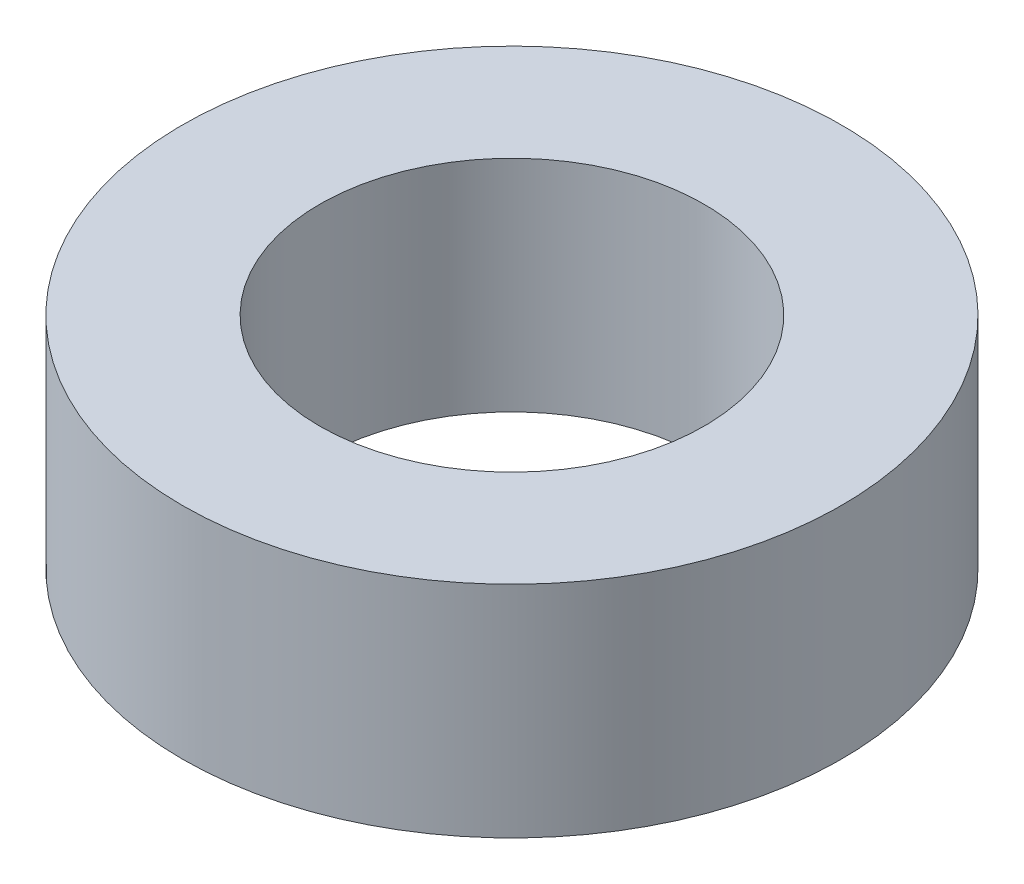
ISO-10303-21;
HEADER;
FILE_DESCRIPTION(('STEP AP214'),'2;1');
FILE_NAME('part.step','',(''),(''),'','','');
FILE_SCHEMA(('AUTOMOTIVE_DESIGN { 1 0 10303 214 1 1 1 1 }'));
ENDSEC;
DATA;
#1=APPLICATION_CONTEXT('core data for automotive mechanical design processes');
#2=APPLICATION_PROTOCOL_DEFINITION('international standard','automotive_design',2000,#1);
#3=PRODUCT_CONTEXT('',#1,'mechanical');
#4=PRODUCT('Part','Part','',(#3));
#5=PRODUCT_RELATED_PRODUCT_CATEGORY('part','',(#4));
#6=PRODUCT_DEFINITION_FORMATION('','',#4);
#7=PRODUCT_DEFINITION_CONTEXT('part definition',#1,'design');
#8=PRODUCT_DEFINITION('design','',#6,#7);
#9=PRODUCT_DEFINITION_SHAPE('','',#8);
#10=(LENGTH_UNIT() NAMED_UNIT(*) SI_UNIT(.MILLI.,.METRE.));
#11=(NAMED_UNIT(*) PLANE_ANGLE_UNIT() SI_UNIT($,.RADIAN.));
#12=(NAMED_UNIT(*) SI_UNIT($,.STERADIAN.) SOLID_ANGLE_UNIT());
#13=UNCERTAINTY_MEASURE_WITH_UNIT(LENGTH_MEASURE(1.E-05),#10,'distance_accuracy_value','');
#14=(GEOMETRIC_REPRESENTATION_CONTEXT(3) GLOBAL_UNCERTAINTY_ASSIGNED_CONTEXT((#13)) GLOBAL_UNIT_ASSIGNED_CONTEXT((#10,
#11,#12)) REPRESENTATION_CONTEXT('',''));
#15=CARTESIAN_POINT('',(0.,0.,0.));
#16=DIRECTION('',(0.,0.,1.));
#17=DIRECTION('',(1.,0.,0.));
#18=AXIS2_PLACEMENT_3D('',#15,#16,#17);
#19=CARTESIAN_POINT('',(0.,2.,0.));
#20=DIRECTION('',(0.,1.,0.));
#21=DIRECTION('',(0.,0.,1.));
#22=AXIS2_PLACEMENT_3D('',#19,#20,#21);
#23=PLANE('',#22);
#24=CARTESIAN_POINT('',(0.,2.,0.));
#25=DIRECTION('',(0.,1.,0.));
#26=DIRECTION('',(0.,0.,1.));
#27=AXIS2_PLACEMENT_3D('',#24,#25,#26);
#28=CIRCLE('',#27,3.);
#29=CARTESIAN_POINT('',(0.,2.,3.));
#30=VERTEX_POINT('',#29);
#31=EDGE_CURVE('E10',#30,#30,#28,.T.);
#32=ORIENTED_EDGE('',*,*,#31,.T.);
#33=EDGE_LOOP('',(#32));
#34=FACE_BOUND('',#33,.T.);
#35=CARTESIAN_POINT('',(0.,2.,0.));
#36=DIRECTION('',(0.,1.,0.));
#37=DIRECTION('',(0.,0.,1.));
#38=AXIS2_PLACEMENT_3D('',#35,#36,#37);
#39=CIRCLE('',#38,1.75);
#40=CARTESIAN_POINT('',(0.,2.,1.75));
#41=VERTEX_POINT('',#40);
#42=EDGE_CURVE('E50',#41,#41,#39,.T.);
#43=ORIENTED_EDGE('',*,*,#42,.F.);
#44=EDGE_LOOP('',(#43));
#45=FACE_BOUND('',#44,.T.);
#46=ADVANCED_FACE('F37',(#34,#45),#23,.T.);
#47=CARTESIAN_POINT('',(0.,0.,0.));
#48=DIRECTION('',(0.,1.,0.));
#49=DIRECTION('',(0.,0.,1.));
#50=AXIS2_PLACEMENT_3D('',#47,#48,#49);
#51=PLANE('',#50);
#52=CARTESIAN_POINT('',(0.,0.,0.));
#53=DIRECTION('',(0.,1.,0.));
#54=DIRECTION('',(0.,0.,1.));
#55=AXIS2_PLACEMENT_3D('',#52,#53,#54);
#56=CIRCLE('',#55,3.);
#57=CARTESIAN_POINT('',(0.,0.,3.));
#58=VERTEX_POINT('',#57);
#59=EDGE_CURVE('E41',#58,#58,#56,.T.);
#60=ORIENTED_EDGE('',*,*,#59,.F.);
#61=EDGE_LOOP('',(#60));
#62=FACE_BOUND('',#61,.T.);
#63=CARTESIAN_POINT('',(0.,0.,0.));
#64=DIRECTION('',(0.,1.,0.));
#65=DIRECTION('',(0.,0.,1.));
#66=AXIS2_PLACEMENT_3D('',#63,#64,#65);
#67=CIRCLE('',#66,1.75);
#68=CARTESIAN_POINT('',(0.,0.,1.75));
#69=VERTEX_POINT('',#68);
#70=EDGE_CURVE('E52',#69,#69,#67,.T.);
#71=ORIENTED_EDGE('',*,*,#70,.T.);
#72=EDGE_LOOP('',(#71));
#73=FACE_BOUND('',#72,.T.);
#74=ADVANCED_FACE('F64',(#62,#73),#51,.F.);
#75=CARTESIAN_POINT('',(0.,2.,0.));
#76=DIRECTION('',(0.,-1.,0.));
#77=DIRECTION('',(0.,0.,-1.));
#78=AXIS2_PLACEMENT_3D('',#75,#76,#77);
#79=CYLINDRICAL_SURFACE('',#78,3.);
#80=ORIENTED_EDGE('',*,*,#31,.F.);
#81=EDGE_LOOP('',(#80));
#82=FACE_BOUND('',#81,.T.);
#83=ORIENTED_EDGE('',*,*,#59,.T.);
#84=EDGE_LOOP('',(#83));
#85=FACE_BOUND('',#84,.T.);
#86=ADVANCED_FACE('F39',(#82,#85),#79,.T.);
#87=CARTESIAN_POINT('',(0.,2.,0.));
#88=DIRECTION('',(0.,-1.,0.));
#89=DIRECTION('',(0.,0.,-1.));
#90=AXIS2_PLACEMENT_3D('',#87,#88,#89);
#91=CYLINDRICAL_SURFACE('',#90,1.75);
#92=ORIENTED_EDGE('',*,*,#42,.T.);
#93=EDGE_LOOP('',(#92));
#94=FACE_BOUND('',#93,.T.);
#95=ORIENTED_EDGE('',*,*,#70,.F.);
#96=EDGE_LOOP('',(#95));
#97=FACE_BOUND('',#96,.T.);
#98=ADVANCED_FACE('F60',(#94,#97),#91,.F.);
#99=CLOSED_SHELL('',(#46,#74,#86,#98));
#100=MANIFOLD_SOLID_BREP('B2',#99);
#101=ADVANCED_BREP_SHAPE_REPRESENTATION('',(#18,#100),#14);
#102=SHAPE_DEFINITION_REPRESENTATION(#9,#101);
ENDSEC;
END-ISO-10303-21;
